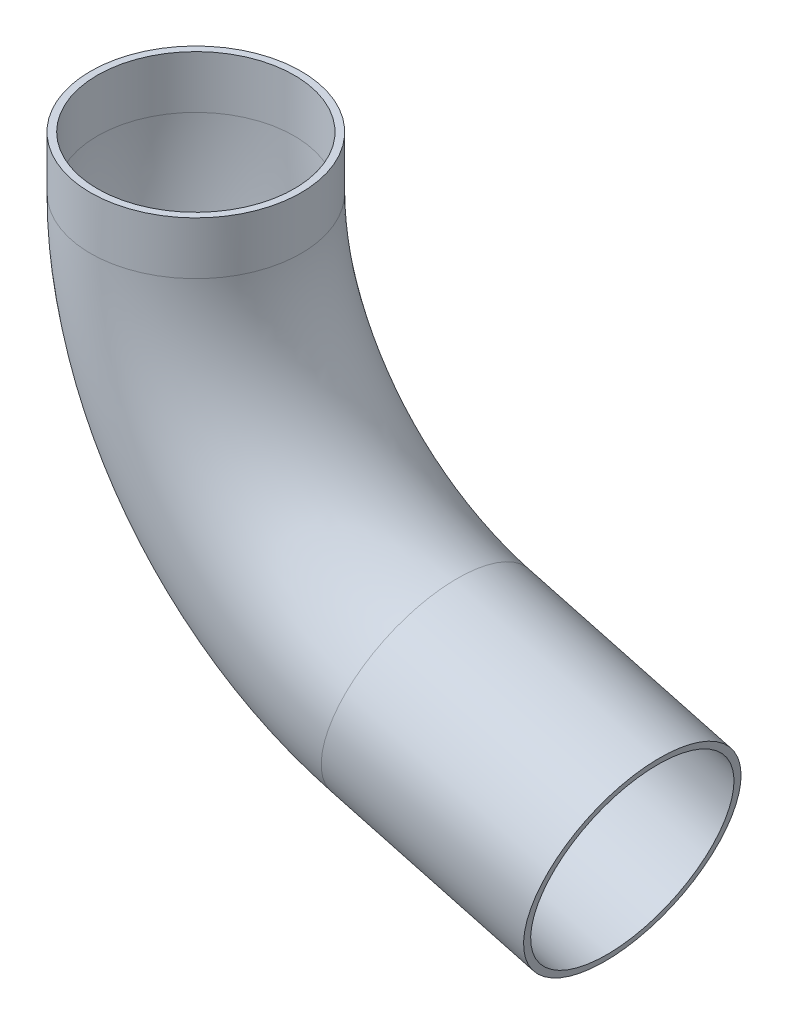
ISO-10303-21;
HEADER;
FILE_DESCRIPTION(('STEP AP214'),'2;1');
FILE_NAME('part.step','',(''),(''),'','','');
FILE_SCHEMA(('AUTOMOTIVE_DESIGN { 1 0 10303 214 1 1 1 1 }'));
ENDSEC;
DATA;
#1=APPLICATION_CONTEXT('core data for automotive mechanical design processes');
#2=APPLICATION_PROTOCOL_DEFINITION('international standard','automotive_design',2000,#1);
#3=PRODUCT_CONTEXT('',#1,'mechanical');
#4=PRODUCT('Part','Part','',(#3));
#5=PRODUCT_RELATED_PRODUCT_CATEGORY('part','',(#4));
#6=PRODUCT_DEFINITION_FORMATION('','',#4);
#7=PRODUCT_DEFINITION_CONTEXT('part definition',#1,'design');
#8=PRODUCT_DEFINITION('design','',#6,#7);
#9=PRODUCT_DEFINITION_SHAPE('','',#8);
#10=(LENGTH_UNIT() NAMED_UNIT(*) SI_UNIT(.MILLI.,.METRE.));
#11=(NAMED_UNIT(*) PLANE_ANGLE_UNIT() SI_UNIT($,.RADIAN.));
#12=(NAMED_UNIT(*) SI_UNIT($,.STERADIAN.) SOLID_ANGLE_UNIT());
#13=UNCERTAINTY_MEASURE_WITH_UNIT(LENGTH_MEASURE(1.E-05),#10,'distance_accuracy_value','');
#14=(GEOMETRIC_REPRESENTATION_CONTEXT(3) GLOBAL_UNCERTAINTY_ASSIGNED_CONTEXT((#13)) GLOBAL_UNIT_ASSIGNED_CONTEXT((#10,
#11,#12)) REPRESENTATION_CONTEXT('',''));
#15=CARTESIAN_POINT('',(0.,0.,0.));
#16=DIRECTION('',(0.,0.,1.));
#17=DIRECTION('',(1.,0.,0.));
#18=AXIS2_PLACEMENT_3D('',#15,#16,#17);
#19=CARTESIAN_POINT('',(56.4779887631881,-86.303547963227,0.));
#20=DIRECTION('',(0.965925826289069,-0.258819045102517,0.));
#21=DIRECTION('',(0.258819045102517,0.965925826289069,0.));
#22=AXIS2_PLACEMENT_3D('',#19,#20,#21);
#23=CYLINDRICAL_SURFACE('',#22,25.4);
#24=CARTESIAN_POINT('',(56.4779887631881,-86.303547963227,0.));
#25=DIRECTION('',(-0.965925826289069,0.258819045102518,0.));
#26=DIRECTION('',(0.,0.,1.));
#27=AXIS2_PLACEMENT_3D('',#24,#25,#26);
#28=CIRCLE('',#27,25.4);
#29=CARTESIAN_POINT('',(49.9039850175842,-110.838063950969,0.));
#30=VERTEX_POINT('',#29);
#31=EDGE_CURVE('E38',#30,#30,#28,.T.);
#32=ORIENTED_EDGE('',*,*,#31,.F.);
#33=EDGE_LOOP('',(#32));
#34=FACE_BOUND('',#33,.T.);
#35=CARTESIAN_POINT('',(105.301675578795,-99.3858154169789,0.));
#36=DIRECTION('',(-0.965925826289069,0.258819045102518,0.));
#37=DIRECTION('',(0.,0.,1.));
#38=AXIS2_PLACEMENT_3D('',#35,#36,#37);
#39=CIRCLE('',#38,25.4);
#40=CARTESIAN_POINT('',(105.301675578795,-99.3858154169789,25.4));
#41=VERTEX_POINT('',#40);
#42=EDGE_CURVE('E10',#41,#41,#39,.T.);
#43=ORIENTED_EDGE('',*,*,#42,.T.);
#44=EDGE_LOOP('',(#43));
#45=FACE_BOUND('',#44,.T.);
#46=ADVANCED_FACE('F28',(#34,#45),#23,.T.);
#47=CARTESIAN_POINT('',(56.4779887631881,-86.303547963227,0.));
#48=DIRECTION('',(0.965925826289069,-0.258819045102517,0.));
#49=DIRECTION('',(0.258819045102517,0.965925826289069,0.));
#50=AXIS2_PLACEMENT_3D('',#47,#48,#49);
#51=CYLINDRICAL_SURFACE('',#50,23.749);
#52=CARTESIAN_POINT('',(56.4779887631881,-86.303547963227,0.));
#53=DIRECTION('',(-0.965925826289069,0.258819045102518,0.));
#54=DIRECTION('',(0.,0.,1.));
#55=AXIS2_PLACEMENT_3D('',#52,#53,#54);
#56=CIRCLE('',#55,23.749);
#57=CARTESIAN_POINT('',(50.3312952610484,-109.243320411766,0.));
#58=VERTEX_POINT('',#57);
#59=EDGE_CURVE('E42',#58,#58,#56,.T.);
#60=ORIENTED_EDGE('',*,*,#59,.T.);
#61=EDGE_LOOP('',(#60));
#62=FACE_BOUND('',#61,.T.);
#63=CARTESIAN_POINT('',(105.301675578795,-99.3858154169789,0.));
#64=DIRECTION('',(-0.965925826289069,0.258819045102518,0.));
#65=DIRECTION('',(0.,0.,1.));
#66=AXIS2_PLACEMENT_3D('',#63,#64,#65);
#67=CIRCLE('',#66,23.749);
#68=CARTESIAN_POINT('',(105.301675578795,-99.3858154169789,23.749));
#69=VERTEX_POINT('',#68);
#70=EDGE_CURVE('E34',#69,#69,#67,.T.);
#71=ORIENTED_EDGE('',*,*,#70,.F.);
#72=EDGE_LOOP('',(#71));
#73=FACE_BOUND('',#72,.T.);
#74=ADVANCED_FACE('F82',(#62,#73),#51,.F.);
#75=CARTESIAN_POINT('',(76.2,-12.7,0.));
#76=DIRECTION('',(0.,0.,1.));
#77=DIRECTION('',(1.,0.,0.));
#78=AXIS2_PLACEMENT_3D('',#75,#76,#77);
#79=TOROIDAL_SURFACE('',#78,76.2,25.4);
#80=CARTESIAN_POINT('',(0.,-12.7,0.));
#81=DIRECTION('',(0.,1.,0.));
#82=DIRECTION('',(0.,0.,1.));
#83=AXIS2_PLACEMENT_3D('',#80,#81,#82);
#84=CIRCLE('',#83,25.4);
#85=CARTESIAN_POINT('',(-25.4,-12.7,0.));
#86=VERTEX_POINT('',#85);
#87=EDGE_CURVE('E47',#86,#86,#84,.T.);
#88=CARTESIAN_POINT('',(76.2,-12.7,0.));
#89=DIRECTION('',(0.,0.,1.));
#90=DIRECTION('',(1.,0.,0.));
#91=AXIS2_PLACEMENT_3D('',#88,#89,#90);
#92=CIRCLE('',#91,101.6);
#93=EDGE_CURVE('',#86,#30,#92,.T.);
#94=ORIENTED_EDGE('',*,*,#87,.F.);
#95=ORIENTED_EDGE('',*,*,#31,.T.);
#96=ORIENTED_EDGE('',*,*,#93,.T.);
#97=ORIENTED_EDGE('',*,*,#93,.F.);
#98=EDGE_LOOP('',(#94,#96,#95,#97));
#99=FACE_BOUND('',#98,.T.);
#100=ADVANCED_FACE('F87',(#99),#79,.T.);
#101=CARTESIAN_POINT('',(76.2,-12.7,0.));
#102=DIRECTION('',(0.,0.,1.));
#103=DIRECTION('',(1.,0.,0.));
#104=AXIS2_PLACEMENT_3D('',#101,#102,#103);
#105=TOROIDAL_SURFACE('',#104,76.2,23.749);
#106=CARTESIAN_POINT('',(0.,-12.7,0.));
#107=DIRECTION('',(0.,1.,0.));
#108=DIRECTION('',(0.,0.,1.));
#109=AXIS2_PLACEMENT_3D('',#106,#107,#108);
#110=CIRCLE('',#109,23.749);
#111=CARTESIAN_POINT('',(-23.749,-12.7,0.));
#112=VERTEX_POINT('',#111);
#113=EDGE_CURVE('E50',#112,#112,#110,.T.);
#114=CARTESIAN_POINT('',(76.2,-12.7,0.));
#115=DIRECTION('',(0.,0.,1.));
#116=DIRECTION('',(1.,0.,0.));
#117=AXIS2_PLACEMENT_3D('',#114,#115,#116);
#118=CIRCLE('',#117,99.949);
#119=EDGE_CURVE('',#112,#58,#118,.T.);
#120=ORIENTED_EDGE('',*,*,#113,.T.);
#121=ORIENTED_EDGE('',*,*,#59,.F.);
#122=ORIENTED_EDGE('',*,*,#119,.T.);
#123=ORIENTED_EDGE('',*,*,#119,.F.);
#124=EDGE_LOOP('',(#120,#122,#121,#123));
#125=FACE_BOUND('',#124,.T.);
#126=ADVANCED_FACE('F78',(#125),#105,.F.);
#127=CARTESIAN_POINT('',(0.,-12.7,0.));
#128=DIRECTION('',(0.,1.,0.));
#129=DIRECTION('',(-1.,0.,0.));
#130=AXIS2_PLACEMENT_3D('',#127,#128,#129);
#131=CYLINDRICAL_SURFACE('',#130,23.749);
#132=ORIENTED_EDGE('',*,*,#113,.F.);
#133=EDGE_LOOP('',(#132));
#134=FACE_BOUND('',#133,.T.);
#135=CARTESIAN_POINT('',(0.,0.,0.));
#136=DIRECTION('',(0.,1.,0.));
#137=DIRECTION('',(0.,0.,1.));
#138=AXIS2_PLACEMENT_3D('',#135,#136,#137);
#139=CIRCLE('',#138,23.749);
#140=CARTESIAN_POINT('',(0.,0.,23.749));
#141=VERTEX_POINT('',#140);
#142=EDGE_CURVE('E56',#141,#141,#139,.T.);
#143=ORIENTED_EDGE('',*,*,#142,.T.);
#144=EDGE_LOOP('',(#143));
#145=FACE_BOUND('',#144,.T.);
#146=ADVANCED_FACE('F60',(#134,#145),#131,.F.);
#147=CARTESIAN_POINT('',(0.,-12.7,0.));
#148=DIRECTION('',(0.,1.,0.));
#149=DIRECTION('',(-1.,0.,0.));
#150=AXIS2_PLACEMENT_3D('',#147,#148,#149);
#151=CYLINDRICAL_SURFACE('',#150,25.4);
#152=ORIENTED_EDGE('',*,*,#87,.T.);
#153=EDGE_LOOP('',(#152));
#154=FACE_BOUND('',#153,.T.);
#155=CARTESIAN_POINT('',(0.,0.,0.));
#156=DIRECTION('',(0.,1.,0.));
#157=DIRECTION('',(0.,0.,1.));
#158=AXIS2_PLACEMENT_3D('',#155,#156,#157);
#159=CIRCLE('',#158,25.4);
#160=CARTESIAN_POINT('',(0.,0.,25.4));
#161=VERTEX_POINT('',#160);
#162=EDGE_CURVE('E53',#161,#161,#159,.T.);
#163=ORIENTED_EDGE('',*,*,#162,.F.);
#164=EDGE_LOOP('',(#163));
#165=FACE_BOUND('',#164,.T.);
#166=ADVANCED_FACE('F69',(#154,#165),#151,.T.);
#167=CARTESIAN_POINT('',(105.301675578795,-99.3858154169789,0.));
#168=DIRECTION('',(-0.965925826289069,0.258819045102518,0.));
#169=DIRECTION('',(0.,0.,1.));
#170=AXIS2_PLACEMENT_3D('',#167,#168,#169);
#171=PLANE('',#170);
#172=ORIENTED_EDGE('',*,*,#70,.T.);
#173=EDGE_LOOP('',(#172));
#174=FACE_BOUND('',#173,.T.);
#175=ORIENTED_EDGE('',*,*,#42,.F.);
#176=EDGE_LOOP('',(#175));
#177=FACE_BOUND('',#176,.T.);
#178=ADVANCED_FACE('F65',(#174,#177),#171,.F.);
#179=CARTESIAN_POINT('',(0.,0.,0.));
#180=DIRECTION('',(0.,1.,0.));
#181=DIRECTION('',(0.,0.,1.));
#182=AXIS2_PLACEMENT_3D('',#179,#180,#181);
#183=PLANE('',#182);
#184=ORIENTED_EDGE('',*,*,#142,.F.);
#185=EDGE_LOOP('',(#184));
#186=FACE_BOUND('',#185,.T.);
#187=ORIENTED_EDGE('',*,*,#162,.T.);
#188=EDGE_LOOP('',(#187));
#189=FACE_BOUND('',#188,.T.);
#190=ADVANCED_FACE('F62',(#186,#189),#183,.T.);
#191=CLOSED_SHELL('',(#46,#74,#100,#126,#146,#166,#178,#190));
#192=MANIFOLD_SOLID_BREP('B2',#191);
#193=ADVANCED_BREP_SHAPE_REPRESENTATION('',(#18,#192),#14);
#194=SHAPE_DEFINITION_REPRESENTATION(#9,#193);
ENDSEC;
END-ISO-10303-21;
